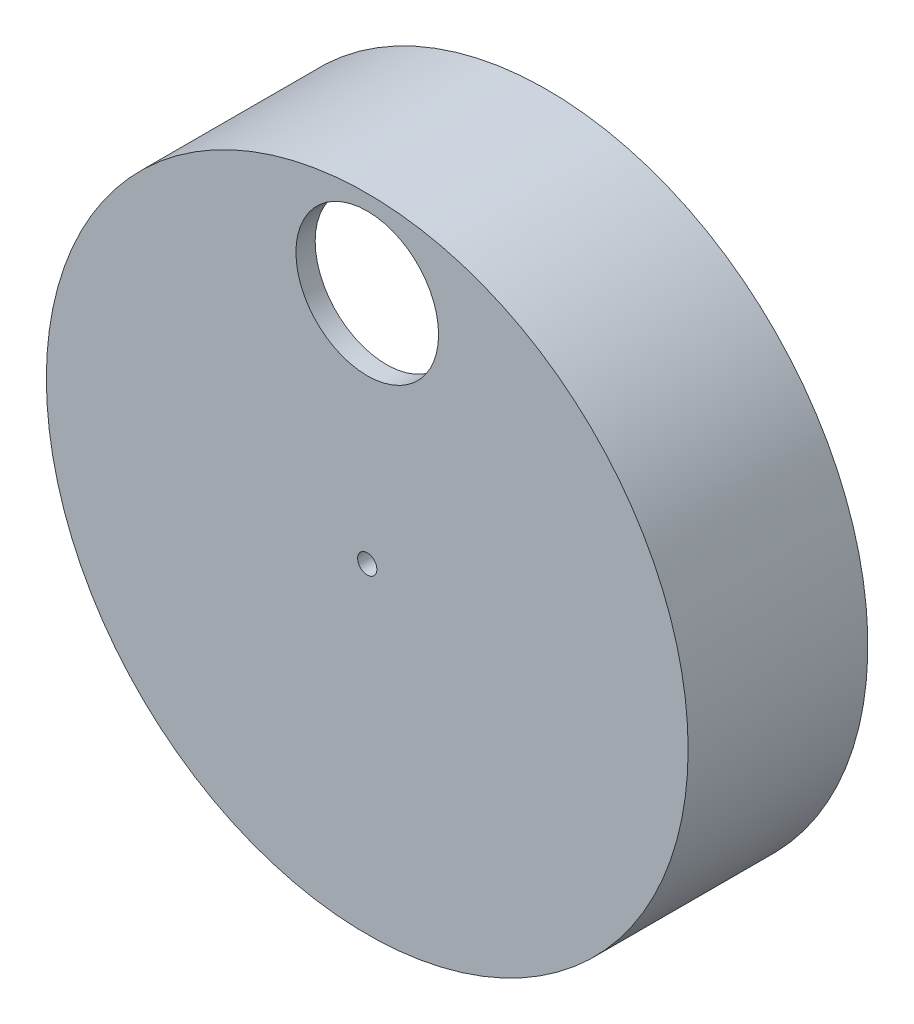
ISO-10303-21;
HEADER;
FILE_DESCRIPTION(('STEP AP214'),'2;1');
FILE_NAME('part.step','',(''),(''),'','','');
FILE_SCHEMA(('AUTOMOTIVE_DESIGN { 1 0 10303 214 1 1 1 1 }'));
ENDSEC;
DATA;
#1=APPLICATION_CONTEXT('core data for automotive mechanical design processes');
#2=APPLICATION_PROTOCOL_DEFINITION('international standard','automotive_design',2000,#1);
#3=PRODUCT_CONTEXT('',#1,'mechanical');
#4=PRODUCT('Part','Part','',(#3));
#5=PRODUCT_RELATED_PRODUCT_CATEGORY('part','',(#4));
#6=PRODUCT_DEFINITION_FORMATION('','',#4);
#7=PRODUCT_DEFINITION_CONTEXT('part definition',#1,'design');
#8=PRODUCT_DEFINITION('design','',#6,#7);
#9=PRODUCT_DEFINITION_SHAPE('','',#8);
#10=(LENGTH_UNIT() NAMED_UNIT(*) SI_UNIT(.MILLI.,.METRE.));
#11=(NAMED_UNIT(*) PLANE_ANGLE_UNIT() SI_UNIT($,.RADIAN.));
#12=(NAMED_UNIT(*) SI_UNIT($,.STERADIAN.) SOLID_ANGLE_UNIT());
#13=UNCERTAINTY_MEASURE_WITH_UNIT(LENGTH_MEASURE(1.E-05),#10,'distance_accuracy_value','');
#14=(GEOMETRIC_REPRESENTATION_CONTEXT(3) GLOBAL_UNCERTAINTY_ASSIGNED_CONTEXT((#13)) GLOBAL_UNIT_ASSIGNED_CONTEXT((#10,
#11,#12)) REPRESENTATION_CONTEXT('',''));
#15=CARTESIAN_POINT('',(0.,0.,0.));
#16=DIRECTION('',(0.,0.,1.));
#17=DIRECTION('',(1.,0.,0.));
#18=AXIS2_PLACEMENT_3D('',#15,#16,#17);
#19=CARTESIAN_POINT('',(0.,0.,6.));
#20=DIRECTION('',(0.,0.,-1.));
#21=DIRECTION('',(-1.,0.,0.));
#22=AXIS2_PLACEMENT_3D('',#19,#20,#21);
#23=CYLINDRICAL_SURFACE('',#22,100.);
#24=CARTESIAN_POINT('',(0.,0.,6.));
#25=DIRECTION('',(0.,0.,1.));
#26=DIRECTION('',(1.,0.,0.));
#27=AXIS2_PLACEMENT_3D('',#24,#25,#26);
#28=CIRCLE('',#27,100.);
#29=CARTESIAN_POINT('',(100.,0.,6.));
#30=VERTEX_POINT('',#29);
#31=EDGE_CURVE('E10',#30,#30,#28,.T.);
#32=ORIENTED_EDGE('',*,*,#31,.F.);
#33=EDGE_LOOP('',(#32));
#34=FACE_BOUND('',#33,.T.);
#35=CARTESIAN_POINT('',(0.,0.,-50.));
#36=DIRECTION('',(0.,0.,-1.));
#37=DIRECTION('',(-1.,0.,0.));
#38=AXIS2_PLACEMENT_3D('',#35,#36,#37);
#39=CIRCLE('',#38,100.);
#40=CARTESIAN_POINT('',(-100.,0.,-50.));
#41=VERTEX_POINT('',#40);
#42=EDGE_CURVE('E39',#41,#41,#39,.T.);
#43=ORIENTED_EDGE('',*,*,#42,.F.);
#44=EDGE_LOOP('',(#43));
#45=FACE_BOUND('',#44,.T.);
#46=ADVANCED_FACE('F33',(#34,#45),#23,.T.);
#47=CARTESIAN_POINT('',(0.,0.,6.));
#48=DIRECTION('',(0.,0.,1.));
#49=DIRECTION('',(1.,0.,0.));
#50=AXIS2_PLACEMENT_3D('',#47,#48,#49);
#51=PLANE('',#50);
#52=CARTESIAN_POINT('',(0.,0.,6.));
#53=DIRECTION('',(0.,0.,1.));
#54=DIRECTION('',(1.,0.,0.));
#55=AXIS2_PLACEMENT_3D('',#52,#53,#54);
#56=CIRCLE('',#55,3.);
#57=CARTESIAN_POINT('',(3.,0.,6.));
#58=VERTEX_POINT('',#57);
#59=EDGE_CURVE('E58',#58,#58,#56,.T.);
#60=ORIENTED_EDGE('',*,*,#59,.F.);
#61=EDGE_LOOP('',(#60));
#62=FACE_BOUND('',#61,.T.);
#63=CARTESIAN_POINT('',(0.,73.,6.));
#64=DIRECTION('',(0.,0.,1.));
#65=DIRECTION('',(1.,0.,0.));
#66=AXIS2_PLACEMENT_3D('',#63,#64,#65);
#67=CIRCLE('',#66,22.225);
#68=CARTESIAN_POINT('',(22.225,73.,6.));
#69=VERTEX_POINT('',#68);
#70=EDGE_CURVE('E51',#69,#69,#67,.T.);
#71=ORIENTED_EDGE('',*,*,#70,.F.);
#72=EDGE_LOOP('',(#71));
#73=FACE_BOUND('',#72,.T.);
#74=ORIENTED_EDGE('',*,*,#31,.T.);
#75=EDGE_LOOP('',(#74));
#76=FACE_BOUND('',#75,.T.);
#77=ADVANCED_FACE('F83',(#62,#73,#76),#51,.T.);
#78=CARTESIAN_POINT('',(0.,0.,-50.));
#79=DIRECTION('',(0.,0.,-1.));
#80=DIRECTION('',(-1.,0.,0.));
#81=AXIS2_PLACEMENT_3D('',#78,#79,#80);
#82=PLANE('',#81);
#83=ORIENTED_EDGE('',*,*,#42,.T.);
#84=EDGE_LOOP('',(#83));
#85=FACE_BOUND('',#84,.T.);
#86=CARTESIAN_POINT('',(0.,0.,-50.));
#87=DIRECTION('',(0.,0.,-1.));
#88=DIRECTION('',(-1.,0.,0.));
#89=AXIS2_PLACEMENT_3D('',#86,#87,#88);
#90=CIRCLE('',#89,97.);
#91=CARTESIAN_POINT('',(-97.,0.,-50.));
#92=VERTEX_POINT('',#91);
#93=EDGE_CURVE('E43',#92,#92,#90,.T.);
#94=ORIENTED_EDGE('',*,*,#93,.F.);
#95=EDGE_LOOP('',(#94));
#96=FACE_BOUND('',#95,.T.);
#97=ADVANCED_FACE('F77',(#85,#96),#82,.T.);
#98=CARTESIAN_POINT('',(0.,0.,-50.));
#99=DIRECTION('',(0.,0.,1.));
#100=DIRECTION('',(1.,0.,0.));
#101=AXIS2_PLACEMENT_3D('',#98,#99,#100);
#102=CYLINDRICAL_SURFACE('',#101,97.);
#103=ORIENTED_EDGE('',*,*,#93,.T.);
#104=EDGE_LOOP('',(#103));
#105=FACE_BOUND('',#104,.T.);
#106=CARTESIAN_POINT('',(0.,0.,0.));
#107=DIRECTION('',(0.,0.,-1.));
#108=DIRECTION('',(-1.,0.,0.));
#109=AXIS2_PLACEMENT_3D('',#106,#107,#108);
#110=CIRCLE('',#109,97.);
#111=CARTESIAN_POINT('',(-97.,0.,0.));
#112=VERTEX_POINT('',#111);
#113=EDGE_CURVE('E47',#112,#112,#110,.T.);
#114=ORIENTED_EDGE('',*,*,#113,.F.);
#115=EDGE_LOOP('',(#114));
#116=FACE_BOUND('',#115,.T.);
#117=ADVANCED_FACE('F71',(#105,#116),#102,.F.);
#118=CARTESIAN_POINT('',(0.,0.,0.));
#119=DIRECTION('',(0.,0.,1.));
#120=DIRECTION('',(1.,0.,0.));
#121=AXIS2_PLACEMENT_3D('',#118,#119,#120);
#122=PLANE('',#121);
#123=CARTESIAN_POINT('',(0.,0.,0.));
#124=DIRECTION('',(0.,0.,-1.));
#125=DIRECTION('',(-1.,0.,0.));
#126=AXIS2_PLACEMENT_3D('',#123,#124,#125);
#127=CIRCLE('',#126,3.);
#128=CARTESIAN_POINT('',(-3.,0.,0.));
#129=VERTEX_POINT('',#128);
#130=EDGE_CURVE('E61',#129,#129,#127,.T.);
#131=ORIENTED_EDGE('',*,*,#130,.F.);
#132=EDGE_LOOP('',(#131));
#133=FACE_BOUND('',#132,.T.);
#134=CARTESIAN_POINT('',(0.,73.,0.));
#135=DIRECTION('',(0.,0.,-1.));
#136=DIRECTION('',(-1.,0.,0.));
#137=AXIS2_PLACEMENT_3D('',#134,#135,#136);
#138=CIRCLE('',#137,22.225);
#139=CARTESIAN_POINT('',(-22.225,73.,0.));
#140=VERTEX_POINT('',#139);
#141=EDGE_CURVE('E55',#140,#140,#138,.T.);
#142=ORIENTED_EDGE('',*,*,#141,.F.);
#143=EDGE_LOOP('',(#142));
#144=FACE_BOUND('',#143,.T.);
#145=ORIENTED_EDGE('',*,*,#113,.T.);
#146=EDGE_LOOP('',(#145));
#147=FACE_BOUND('',#146,.T.);
#148=ADVANCED_FACE('F67',(#133,#144,#147),#122,.F.);
#149=CARTESIAN_POINT('',(0.,73.,50.));
#150=DIRECTION('',(0.,0.,-1.));
#151=DIRECTION('',(-1.,0.,0.));
#152=AXIS2_PLACEMENT_3D('',#149,#150,#151);
#153=CYLINDRICAL_SURFACE('',#152,22.225);
#154=ORIENTED_EDGE('',*,*,#70,.T.);
#155=EDGE_LOOP('',(#154));
#156=FACE_BOUND('',#155,.T.);
#157=ORIENTED_EDGE('',*,*,#141,.T.);
#158=EDGE_LOOP('',(#157));
#159=FACE_BOUND('',#158,.T.);
#160=ADVANCED_FACE('F70',(#156,#159),#153,.F.);
#161=CARTESIAN_POINT('',(0.,0.,50.));
#162=DIRECTION('',(0.,0.,-1.));
#163=DIRECTION('',(-1.,0.,0.));
#164=AXIS2_PLACEMENT_3D('',#161,#162,#163);
#165=CYLINDRICAL_SURFACE('',#164,3.);
#166=ORIENTED_EDGE('',*,*,#59,.T.);
#167=EDGE_LOOP('',(#166));
#168=FACE_BOUND('',#167,.T.);
#169=ORIENTED_EDGE('',*,*,#130,.T.);
#170=EDGE_LOOP('',(#169));
#171=FACE_BOUND('',#170,.T.);
#172=ADVANCED_FACE('F65',(#168,#171),#165,.F.);
#173=CLOSED_SHELL('',(#46,#77,#97,#117,#148,#160,#172));
#174=MANIFOLD_SOLID_BREP('B2',#173);
#175=ADVANCED_BREP_SHAPE_REPRESENTATION('',(#18,#174),#14);
#176=SHAPE_DEFINITION_REPRESENTATION(#9,#175);
ENDSEC;
END-ISO-10303-21;
